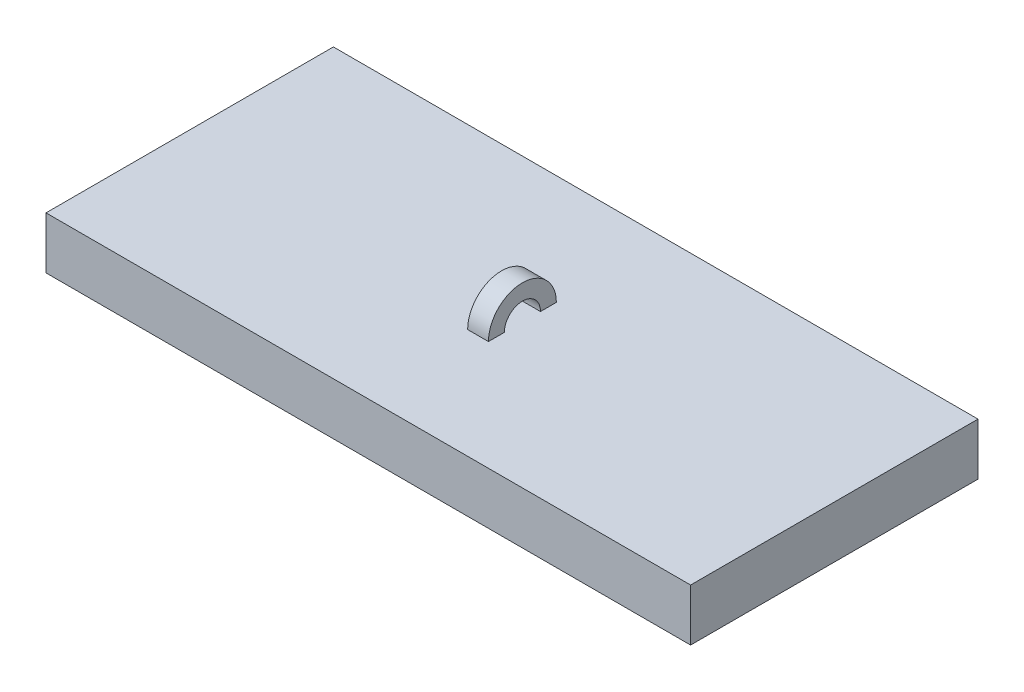
ISO-10303-21;
HEADER;
FILE_DESCRIPTION(('STEP AP214'),'2;1');
FILE_NAME('part.step','',(''),(''),'','','');
FILE_SCHEMA(('AUTOMOTIVE_DESIGN { 1 0 10303 214 1 1 1 1 }'));
ENDSEC;
DATA;
#1=APPLICATION_CONTEXT('core data for automotive mechanical design processes');
#2=APPLICATION_PROTOCOL_DEFINITION('international standard','automotive_design',2000,#1);
#3=PRODUCT_CONTEXT('',#1,'mechanical');
#4=PRODUCT('Part','Part','',(#3));
#5=PRODUCT_RELATED_PRODUCT_CATEGORY('part','',(#4));
#6=PRODUCT_DEFINITION_FORMATION('','',#4);
#7=PRODUCT_DEFINITION_CONTEXT('part definition',#1,'design');
#8=PRODUCT_DEFINITION('design','',#6,#7);
#9=PRODUCT_DEFINITION_SHAPE('','',#8);
#10=(LENGTH_UNIT() NAMED_UNIT(*) SI_UNIT(.MILLI.,.METRE.));
#11=(NAMED_UNIT(*) PLANE_ANGLE_UNIT() SI_UNIT($,.RADIAN.));
#12=(NAMED_UNIT(*) SI_UNIT($,.STERADIAN.) SOLID_ANGLE_UNIT());
#13=UNCERTAINTY_MEASURE_WITH_UNIT(LENGTH_MEASURE(1.E-05),#10,'distance_accuracy_value','');
#14=(GEOMETRIC_REPRESENTATION_CONTEXT(3) GLOBAL_UNCERTAINTY_ASSIGNED_CONTEXT((#13)) GLOBAL_UNIT_ASSIGNED_CONTEXT((#10,
#11,#12)) REPRESENTATION_CONTEXT('',''));
#15=CARTESIAN_POINT('',(0.,0.,0.));
#16=DIRECTION('',(0.,0.,1.));
#17=DIRECTION('',(1.,0.,0.));
#18=AXIS2_PLACEMENT_3D('',#15,#16,#17);
#19=CARTESIAN_POINT('',(61.9549101193876,10.,27.6215640948936));
#20=DIRECTION('',(-1.,0.,0.));
#21=DIRECTION('',(0.,0.,1.));
#22=AXIS2_PLACEMENT_3D('',#19,#20,#21);
#23=PLANE('',#22);
#24=DIRECTION('',(0.,0.,-1.));
#25=VECTOR('',#24,1.);
#26=CARTESIAN_POINT('',(61.9549101193876,0.,27.6215640948936));
#27=LINE('',#26,#25);
#28=CARTESIAN_POINT('',(61.9549101193876,0.,27.6215640948936));
#29=VERTEX_POINT('',#28);
#30=CARTESIAN_POINT('',(61.9549101193876,0.,-27.6215640948936));
#31=VERTEX_POINT('',#30);
#32=EDGE_CURVE('E142',#29,#31,#27,.T.);
#33=ORIENTED_EDGE('',*,*,#32,.T.);
#34=DIRECTION('',(0.,-1.,0.));
#35=VECTOR('',#34,1.);
#36=CARTESIAN_POINT('',(61.9549101193876,10.,-27.6215640948936));
#37=LINE('',#36,#35);
#38=CARTESIAN_POINT('',(61.9549101193876,10.,-27.6215640948936));
#39=VERTEX_POINT('',#38);
#40=EDGE_CURVE('E11',#39,#31,#37,.T.);
#41=ORIENTED_EDGE('',*,*,#40,.F.);
#42=DIRECTION('',(0.,0.,-1.));
#43=VECTOR('',#42,1.);
#44=CARTESIAN_POINT('',(61.9549101193876,10.,27.6215640948936));
#45=LINE('',#44,#43);
#46=CARTESIAN_POINT('',(61.9549101193876,10.,27.6215640948936));
#47=VERTEX_POINT('',#46);
#48=EDGE_CURVE('E143',#47,#39,#45,.T.);
#49=ORIENTED_EDGE('',*,*,#48,.F.);
#50=DIRECTION('',(0.,-1.,0.));
#51=VECTOR('',#50,1.);
#52=CARTESIAN_POINT('',(61.9549101193876,10.,27.6215640948936));
#53=LINE('',#52,#51);
#54=EDGE_CURVE('E153',#47,#29,#53,.T.);
#55=ORIENTED_EDGE('',*,*,#54,.T.);
#56=EDGE_LOOP('',(#33,#41,#49,#55));
#57=FACE_BOUND('',#56,.T.);
#58=ADVANCED_FACE('F41',(#57),#23,.F.);
#59=CARTESIAN_POINT('',(-61.9549101193876,10.,-27.6215640948936));
#60=DIRECTION('',(0.,0.,1.));
#61=DIRECTION('',(1.,0.,0.));
#62=AXIS2_PLACEMENT_3D('',#59,#60,#61);
#63=PLANE('',#62);
#64=DIRECTION('',(-1.,0.,0.));
#65=VECTOR('',#64,1.);
#66=CARTESIAN_POINT('',(-61.9549101193876,0.,-27.6215640948936));
#67=LINE('',#66,#65);
#68=CARTESIAN_POINT('',(-61.9549101193876,0.,-27.6215640948936));
#69=VERTEX_POINT('',#68);
#70=EDGE_CURVE('E156',#31,#69,#67,.T.);
#71=ORIENTED_EDGE('',*,*,#70,.T.);
#72=DIRECTION('',(0.,-1.,0.));
#73=VECTOR('',#72,1.);
#74=CARTESIAN_POINT('',(-61.9549101193876,10.,-27.6215640948936));
#75=LINE('',#74,#73);
#76=CARTESIAN_POINT('',(-61.9549101193876,10.,-27.6215640948936));
#77=VERTEX_POINT('',#76);
#78=EDGE_CURVE('E48',#77,#69,#75,.T.);
#79=ORIENTED_EDGE('',*,*,#78,.F.);
#80=DIRECTION('',(-1.,0.,0.));
#81=VECTOR('',#80,1.);
#82=CARTESIAN_POINT('',(-61.9549101193876,10.,-27.6215640948936));
#83=LINE('',#82,#81);
#84=EDGE_CURVE('E146',#39,#77,#83,.T.);
#85=ORIENTED_EDGE('',*,*,#84,.F.);
#86=ORIENTED_EDGE('',*,*,#40,.T.);
#87=EDGE_LOOP('',(#71,#79,#85,#86));
#88=FACE_BOUND('',#87,.T.);
#89=ADVANCED_FACE('F184',(#88),#63,.F.);
#90=CARTESIAN_POINT('',(-61.9549101193876,10.,27.6215640948936));
#91=DIRECTION('',(1.,0.,0.));
#92=DIRECTION('',(0.,0.,-1.));
#93=AXIS2_PLACEMENT_3D('',#90,#91,#92);
#94=PLANE('',#93);
#95=DIRECTION('',(0.,0.,1.));
#96=VECTOR('',#95,1.);
#97=CARTESIAN_POINT('',(-61.9549101193876,0.,27.6215640948936));
#98=LINE('',#97,#96);
#99=CARTESIAN_POINT('',(-61.9549101193876,0.,27.6215640948936));
#100=VERTEX_POINT('',#99);
#101=EDGE_CURVE('E158',#69,#100,#98,.T.);
#102=ORIENTED_EDGE('',*,*,#101,.T.);
#103=DIRECTION('',(0.,-1.,0.));
#104=VECTOR('',#103,1.);
#105=CARTESIAN_POINT('',(-61.9549101193876,10.,27.6215640948936));
#106=LINE('',#105,#104);
#107=CARTESIAN_POINT('',(-61.9549101193876,10.,27.6215640948936));
#108=VERTEX_POINT('',#107);
#109=EDGE_CURVE('E163',#108,#100,#106,.T.);
#110=ORIENTED_EDGE('',*,*,#109,.F.);
#111=DIRECTION('',(0.,0.,1.));
#112=VECTOR('',#111,1.);
#113=CARTESIAN_POINT('',(-61.9549101193876,10.,27.6215640948936));
#114=LINE('',#113,#112);
#115=EDGE_CURVE('E149',#77,#108,#114,.T.);
#116=ORIENTED_EDGE('',*,*,#115,.F.);
#117=ORIENTED_EDGE('',*,*,#78,.T.);
#118=EDGE_LOOP('',(#102,#110,#116,#117));
#119=FACE_BOUND('',#118,.T.);
#120=ADVANCED_FACE('F170',(#119),#94,.F.);
#121=CARTESIAN_POINT('',(-61.9549101193876,10.,27.6215640948936));
#122=DIRECTION('',(0.,0.,-1.));
#123=DIRECTION('',(-1.,0.,0.));
#124=AXIS2_PLACEMENT_3D('',#121,#122,#123);
#125=PLANE('',#124);
#126=DIRECTION('',(1.,0.,0.));
#127=VECTOR('',#126,1.);
#128=CARTESIAN_POINT('',(-61.9549101193876,0.,27.6215640948936));
#129=LINE('',#128,#127);
#130=EDGE_CURVE('E147',#100,#29,#129,.T.);
#131=ORIENTED_EDGE('',*,*,#130,.T.);
#132=ORIENTED_EDGE('',*,*,#54,.F.);
#133=DIRECTION('',(1.,0.,0.));
#134=VECTOR('',#133,1.);
#135=CARTESIAN_POINT('',(-61.9549101193876,10.,27.6215640948936));
#136=LINE('',#135,#134);
#137=EDGE_CURVE('E151',#108,#47,#136,.T.);
#138=ORIENTED_EDGE('',*,*,#137,.F.);
#139=ORIENTED_EDGE('',*,*,#109,.T.);
#140=EDGE_LOOP('',(#131,#132,#138,#139));
#141=FACE_BOUND('',#140,.T.);
#142=ADVANCED_FACE('F179',(#141),#125,.F.);
#143=CARTESIAN_POINT('',(0.,10.,0.));
#144=DIRECTION('',(0.,-1.,0.));
#145=DIRECTION('',(0.,0.,-1.));
#146=AXIS2_PLACEMENT_3D('',#143,#144,#145);
#147=PLANE('',#146);
#148=DIRECTION('',(1.,0.,0.));
#149=VECTOR('',#148,1.);
#150=CARTESIAN_POINT('',(0.,9.99999999999998,3.47188445449716));
#151=LINE('',#150,#149);
#152=CARTESIAN_POINT('',(-2.,9.99999999999998,3.47188445449716));
#153=VERTEX_POINT('',#152);
#154=CARTESIAN_POINT('',(2.,10.,3.47188445449716));
#155=VERTEX_POINT('',#154);
#156=EDGE_CURVE('E121',#153,#155,#151,.T.);
#157=ORIENTED_EDGE('',*,*,#156,.T.);
#158=DIRECTION('',(0.,0.,-1.));
#159=VECTOR('',#158,1.);
#160=CARTESIAN_POINT('',(2.,10.,0.));
#161=LINE('',#160,#159);
#162=CARTESIAN_POINT('',(2.,10.,6.52714277445463));
#163=VERTEX_POINT('',#162);
#164=EDGE_CURVE('E55',#163,#155,#161,.T.);
#165=ORIENTED_EDGE('',*,*,#164,.F.);
#166=DIRECTION('',(1.,0.,0.));
#167=VECTOR('',#166,1.);
#168=CARTESIAN_POINT('',(0.,9.99999999999996,6.52714277445463));
#169=LINE('',#168,#167);
#170=CARTESIAN_POINT('',(-2.,10.,6.52714277445463));
#171=VERTEX_POINT('',#170);
#172=EDGE_CURVE('E60',#171,#163,#169,.T.);
#173=ORIENTED_EDGE('',*,*,#172,.F.);
#174=DIRECTION('',(0.,0.,-1.));
#175=VECTOR('',#174,1.);
#176=CARTESIAN_POINT('',(-2.,10.,0.));
#177=LINE('',#176,#175);
#178=EDGE_CURVE('E133',#171,#153,#177,.T.);
#179=ORIENTED_EDGE('',*,*,#178,.T.);
#180=EDGE_LOOP('',(#157,#165,#173,#179));
#181=FACE_BOUND('',#180,.T.);
#182=DIRECTION('',(1.,0.,0.));
#183=VECTOR('',#182,1.);
#184=CARTESIAN_POINT('',(0.,10.,-6.52714277445463));
#185=LINE('',#184,#183);
#186=CARTESIAN_POINT('',(-2.,10.,-6.52714277445463));
#187=VERTEX_POINT('',#186);
#188=CARTESIAN_POINT('',(2.,10.,-6.52714277445463));
#189=VERTEX_POINT('',#188);
#190=EDGE_CURVE('E111',#187,#189,#185,.T.);
#191=ORIENTED_EDGE('',*,*,#190,.T.);
#192=DIRECTION('',(0.,0.,1.));
#193=VECTOR('',#192,1.);
#194=CARTESIAN_POINT('',(2.,10.,0.));
#195=LINE('',#194,#193);
#196=CARTESIAN_POINT('',(2.,10.,-3.47188445449716));
#197=VERTEX_POINT('',#196);
#198=EDGE_CURVE('E103',#189,#197,#195,.T.);
#199=ORIENTED_EDGE('',*,*,#198,.T.);
#200=DIRECTION('',(1.,0.,0.));
#201=VECTOR('',#200,1.);
#202=CARTESIAN_POINT('',(0.,10.,-3.47188445449716));
#203=LINE('',#202,#201);
#204=CARTESIAN_POINT('',(-1.99999999999999,10.,-3.47188445449716));
#205=VERTEX_POINT('',#204);
#206=EDGE_CURVE('E108',#205,#197,#203,.T.);
#207=ORIENTED_EDGE('',*,*,#206,.F.);
#208=DIRECTION('',(0.,0.,1.));
#209=VECTOR('',#208,1.);
#210=CARTESIAN_POINT('',(-2.,10.,0.));
#211=LINE('',#210,#209);
#212=EDGE_CURVE('E126',#187,#205,#211,.T.);
#213=ORIENTED_EDGE('',*,*,#212,.F.);
#214=EDGE_LOOP('',(#191,#199,#207,#213));
#215=FACE_BOUND('',#214,.T.);
#216=ORIENTED_EDGE('',*,*,#48,.T.);
#217=ORIENTED_EDGE('',*,*,#84,.T.);
#218=ORIENTED_EDGE('',*,*,#115,.T.);
#219=ORIENTED_EDGE('',*,*,#137,.T.);
#220=EDGE_LOOP('',(#216,#217,#218,#219));
#221=FACE_BOUND('',#220,.T.);
#222=ADVANCED_FACE('F105',(#181,#215,#221),#147,.F.);
#223=CARTESIAN_POINT('',(0.,0.,0.));
#224=DIRECTION('',(0.,-1.,0.));
#225=DIRECTION('',(0.,0.,-1.));
#226=AXIS2_PLACEMENT_3D('',#223,#224,#225);
#227=PLANE('',#226);
#228=ORIENTED_EDGE('',*,*,#32,.F.);
#229=ORIENTED_EDGE('',*,*,#130,.F.);
#230=ORIENTED_EDGE('',*,*,#101,.F.);
#231=ORIENTED_EDGE('',*,*,#70,.F.);
#232=EDGE_LOOP('',(#228,#229,#230,#231));
#233=FACE_BOUND('',#232,.T.);
#234=ADVANCED_FACE('F176',(#233),#227,.T.);
#235=CARTESIAN_POINT('',(2.,10.,0.));
#236=DIRECTION('',(1.,0.,0.));
#237=DIRECTION('',(0.,0.,-1.));
#238=AXIS2_PLACEMENT_3D('',#235,#236,#237);
#239=PLANE('',#238);
#240=CARTESIAN_POINT('',(2.,10.,0.));
#241=DIRECTION('',(-1.,0.,0.));
#242=DIRECTION('',(0.,0.,1.));
#243=AXIS2_PLACEMENT_3D('',#240,#241,#242);
#244=CIRCLE('',#243,6.52714277445463);
#245=EDGE_CURVE('E140',#163,#189,#244,.T.);
#246=ORIENTED_EDGE('',*,*,#245,.F.);
#247=ORIENTED_EDGE('',*,*,#164,.T.);
#248=CARTESIAN_POINT('',(2.,10.,0.));
#249=DIRECTION('',(-1.,0.,0.));
#250=DIRECTION('',(0.,0.,1.));
#251=AXIS2_PLACEMENT_3D('',#248,#249,#250);
#252=CIRCLE('',#251,3.47188445449716);
#253=EDGE_CURVE('E116',#155,#197,#252,.T.);
#254=ORIENTED_EDGE('',*,*,#253,.T.);
#255=ORIENTED_EDGE('',*,*,#198,.F.);
#256=EDGE_LOOP('',(#246,#247,#254,#255));
#257=FACE_BOUND('',#256,.T.);
#258=ADVANCED_FACE('F117',(#257),#239,.T.);
#259=CARTESIAN_POINT('',(-61.9549101193876,10.,0.));
#260=DIRECTION('',(-1.,0.,0.));
#261=DIRECTION('',(0.,0.,1.));
#262=AXIS2_PLACEMENT_3D('',#259,#260,#261);
#263=CYLINDRICAL_SURFACE('',#262,6.52714277445463);
#264=CARTESIAN_POINT('',(-2.,10.,0.));
#265=DIRECTION('',(-1.,0.,0.));
#266=DIRECTION('',(0.,0.,1.));
#267=AXIS2_PLACEMENT_3D('',#264,#265,#266);
#268=CIRCLE('',#267,6.52714277445463);
#269=EDGE_CURVE('E137',#171,#187,#268,.T.);
#270=ORIENTED_EDGE('',*,*,#269,.F.);
#271=ORIENTED_EDGE('',*,*,#172,.T.);
#272=ORIENTED_EDGE('',*,*,#245,.T.);
#273=ORIENTED_EDGE('',*,*,#190,.F.);
#274=EDGE_LOOP('',(#270,#271,#272,#273));
#275=FACE_BOUND('',#274,.T.);
#276=ADVANCED_FACE('F198',(#275),#263,.T.);
#277=CARTESIAN_POINT('',(-2.,10.,0.));
#278=DIRECTION('',(1.,0.,0.));
#279=DIRECTION('',(0.,0.,-1.));
#280=AXIS2_PLACEMENT_3D('',#277,#278,#279);
#281=PLANE('',#280);
#282=CARTESIAN_POINT('',(-1.99999999999999,10.,0.));
#283=DIRECTION('',(-1.,0.,0.));
#284=DIRECTION('',(0.,0.,1.));
#285=AXIS2_PLACEMENT_3D('',#282,#283,#284);
#286=CIRCLE('',#285,3.47188445449716);
#287=EDGE_CURVE('E120',#153,#205,#286,.T.);
#288=ORIENTED_EDGE('',*,*,#287,.F.);
#289=ORIENTED_EDGE('',*,*,#178,.F.);
#290=ORIENTED_EDGE('',*,*,#269,.T.);
#291=ORIENTED_EDGE('',*,*,#212,.T.);
#292=EDGE_LOOP('',(#288,#289,#290,#291));
#293=FACE_BOUND('',#292,.T.);
#294=ADVANCED_FACE('F201',(#293),#281,.F.);
#295=CARTESIAN_POINT('',(-61.9549101193876,10.,0.));
#296=DIRECTION('',(-1.,0.,0.));
#297=DIRECTION('',(0.,0.,1.));
#298=AXIS2_PLACEMENT_3D('',#295,#296,#297);
#299=CYLINDRICAL_SURFACE('',#298,3.47188445449716);
#300=ORIENTED_EDGE('',*,*,#156,.F.);
#301=ORIENTED_EDGE('',*,*,#287,.T.);
#302=ORIENTED_EDGE('',*,*,#206,.T.);
#303=ORIENTED_EDGE('',*,*,#253,.F.);
#304=EDGE_LOOP('',(#300,#301,#302,#303));
#305=FACE_BOUND('',#304,.T.);
#306=ADVANCED_FACE('F123',(#305),#299,.F.);
#307=CLOSED_SHELL('',(#58,#89,#120,#142,#222,#234,#258,#276,#294,#306));
#308=MANIFOLD_SOLID_BREP('B2',#307);
#309=ADVANCED_BREP_SHAPE_REPRESENTATION('',(#18,#308),#14);
#310=SHAPE_DEFINITION_REPRESENTATION(#9,#309);
ENDSEC;
END-ISO-10303-21;
